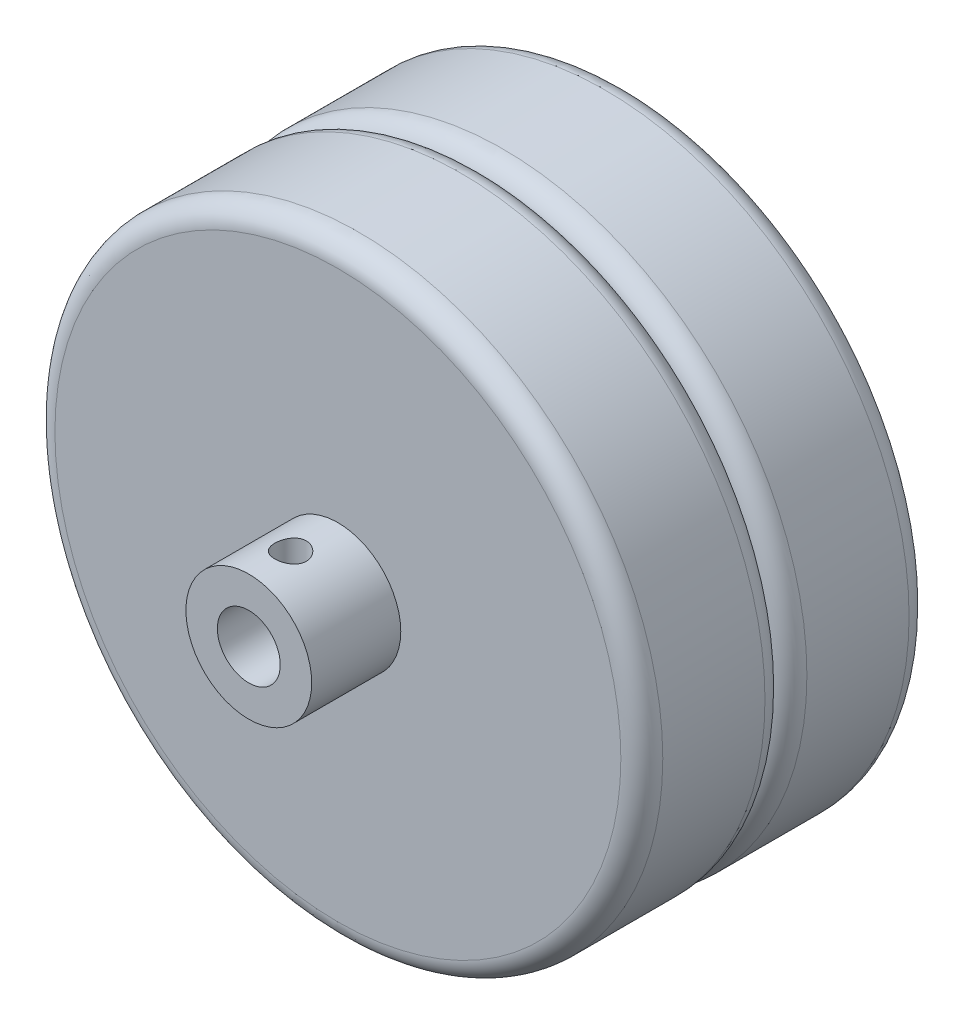
ISO-10303-21;
HEADER;
FILE_DESCRIPTION(('STEP AP214'),'2;1');
FILE_NAME('part.step','',(''),(''),'','','');
FILE_SCHEMA(('AUTOMOTIVE_DESIGN { 1 0 10303 214 1 1 1 1 }'));
ENDSEC;
DATA;
#1=APPLICATION_CONTEXT('core data for automotive mechanical design processes');
#2=APPLICATION_PROTOCOL_DEFINITION('international standard','automotive_design',2000,#1);
#3=PRODUCT_CONTEXT('',#1,'mechanical');
#4=PRODUCT('Part','Part','',(#3));
#5=PRODUCT_RELATED_PRODUCT_CATEGORY('part','',(#4));
#6=PRODUCT_DEFINITION_FORMATION('','',#4);
#7=PRODUCT_DEFINITION_CONTEXT('part definition',#1,'design');
#8=PRODUCT_DEFINITION('design','',#6,#7);
#9=PRODUCT_DEFINITION_SHAPE('','',#8);
#10=(LENGTH_UNIT() NAMED_UNIT(*) SI_UNIT(.MILLI.,.METRE.));
#11=(NAMED_UNIT(*) PLANE_ANGLE_UNIT() SI_UNIT($,.RADIAN.));
#12=(NAMED_UNIT(*) SI_UNIT($,.STERADIAN.) SOLID_ANGLE_UNIT());
#13=UNCERTAINTY_MEASURE_WITH_UNIT(LENGTH_MEASURE(1.E-05),#10,'distance_accuracy_value','');
#14=(GEOMETRIC_REPRESENTATION_CONTEXT(3) GLOBAL_UNCERTAINTY_ASSIGNED_CONTEXT((#13)) GLOBAL_UNIT_ASSIGNED_CONTEXT((#10,
#11,#12)) REPRESENTATION_CONTEXT('',''));
#15=CARTESIAN_POINT('',(0.,0.,0.));
#16=DIRECTION('',(0.,0.,1.));
#17=DIRECTION('',(1.,0.,0.));
#18=AXIS2_PLACEMENT_3D('',#15,#16,#17);
#19=CARTESIAN_POINT('',(0.,0.,36.));
#20=DIRECTION('',(0.,0.,1.));
#21=DIRECTION('',(1.,0.,0.));
#22=AXIS2_PLACEMENT_3D('',#19,#20,#21);
#23=PLANE('',#22);
#24=CARTESIAN_POINT('',(0.,0.,36.));
#25=DIRECTION('',(0.,0.,1.));
#26=DIRECTION('',(1.,0.,0.));
#27=AXIS2_PLACEMENT_3D('',#24,#25,#26);
#28=CIRCLE('',#27,6.);
#29=CARTESIAN_POINT('',(6.,0.,36.));
#30=VERTEX_POINT('',#29);
#31=EDGE_CURVE('E11',#30,#30,#28,.T.);
#32=ORIENTED_EDGE('',*,*,#31,.T.);
#33=EDGE_LOOP('',(#32));
#34=FACE_BOUND('',#33,.T.);
#35=CARTESIAN_POINT('',(0.,0.,36.));
#36=DIRECTION('',(0.,0.,1.));
#37=DIRECTION('',(1.,0.,0.));
#38=AXIS2_PLACEMENT_3D('',#35,#36,#37);
#39=CIRCLE('',#38,3.);
#40=CARTESIAN_POINT('',(3.,0.,36.));
#41=VERTEX_POINT('',#40);
#42=EDGE_CURVE('E58',#41,#41,#39,.T.);
#43=ORIENTED_EDGE('',*,*,#42,.F.);
#44=EDGE_LOOP('',(#43));
#45=FACE_BOUND('',#44,.T.);
#46=ADVANCED_FACE('F39',(#34,#45),#23,.T.);
#47=CARTESIAN_POINT('',(0.,0.,27.5));
#48=DIRECTION('',(0.,0.,1.));
#49=DIRECTION('',(1.,0.,0.));
#50=AXIS2_PLACEMENT_3D('',#47,#48,#49);
#51=PLANE('',#50);
#52=CARTESIAN_POINT('',(0.,0.,27.5));
#53=DIRECTION('',(0.,0.,1.));
#54=DIRECTION('',(1.,0.,0.));
#55=AXIS2_PLACEMENT_3D('',#52,#53,#54);
#56=CIRCLE('',#55,6.);
#57=CARTESIAN_POINT('',(6.,0.,27.5));
#58=VERTEX_POINT('',#57);
#59=EDGE_CURVE('E53',#58,#58,#56,.T.);
#60=ORIENTED_EDGE('',*,*,#59,.F.);
#61=EDGE_LOOP('',(#60));
#62=FACE_BOUND('',#61,.T.);
#63=CARTESIAN_POINT('',(0.,0.,27.5));
#64=DIRECTION('',(0.,0.,1.));
#65=DIRECTION('',(1.,0.,0.));
#66=AXIS2_PLACEMENT_3D('',#63,#64,#65);
#67=CIRCLE('',#66,3.);
#68=CARTESIAN_POINT('',(3.,0.,27.5));
#69=VERTEX_POINT('',#68);
#70=EDGE_CURVE('E60',#69,#69,#67,.T.);
#71=ORIENTED_EDGE('',*,*,#70,.T.);
#72=EDGE_LOOP('',(#71));
#73=FACE_BOUND('',#72,.T.);
#74=ADVANCED_FACE('F81',(#62,#73),#51,.F.);
#75=CARTESIAN_POINT('',(0.,0.,36.));
#76=DIRECTION('',(0.,0.,-1.));
#77=DIRECTION('',(-1.,0.,0.));
#78=AXIS2_PLACEMENT_3D('',#75,#76,#77);
#79=CYLINDRICAL_SURFACE('',#78,6.);
#80=CARTESIAN_POINT('',(0.,6.,33.5150195560629));
#81=CARTESIAN_POINT('',(-0.0828760886697312,5.99999859868013,33.5150172303247));
#82=CARTESIAN_POINT('',(-0.165778157830763,5.99826578131828,33.5081280052891));
#83=CARTESIAN_POINT('',(-0.329206323770533,5.99152113829892,33.4807944047559));
#84=CARTESIAN_POINT('',(-0.40973104687074,5.98650745419968,33.460342346525));
#85=CARTESIAN_POINT('',(-0.566020872182579,5.9737562633204,33.4065803026008));
#86=CARTESIAN_POINT('',(-0.641791563430005,5.96602202842087,33.3732857573476));
#87=CARTESIAN_POINT('',(-0.786672131904429,5.94865343807593,33.2948381660181));
#88=CARTESIAN_POINT('',(-0.855781784348761,5.9390190185405,33.249684719944));
#89=CARTESIAN_POINT('',(-0.986801927300921,5.91867413591801,33.1478187664087));
#90=CARTESIAN_POINT('',(-1.04855569006107,5.90794707148533,33.0909079811037));
#91=CARTESIAN_POINT('',(-1.1617489272033,5.8867362011753,32.967567351154));
#92=CARTESIAN_POINT('',(-1.21318723694914,5.87625242288348,32.9011364331164));
#93=CARTESIAN_POINT('',(-1.30502654279903,5.8565477569971,32.7594243293255));
#94=CARTESIAN_POINT('',(-1.34525221592536,5.84734794470605,32.6840263252525));
#95=CARTESIAN_POINT('',(-1.41239690855053,5.83149494812223,32.5272711444045));
#96=CARTESIAN_POINT('',(-1.43931805543933,5.82484135672789,32.4459149227371));
#97=CARTESIAN_POINT('',(-1.47855483680429,5.81500476717551,32.2812760578604));
#98=CARTESIAN_POINT('',(-1.49115226833334,5.81175491075426,32.1980646600131));
#99=CARTESIAN_POINT('',(-1.50226177506785,5.80889362537741,32.0306509870489));
#100=CARTESIAN_POINT('',(-1.50077614181798,5.80928160448644,31.9464488753643));
#101=CARTESIAN_POINT('',(-1.48398652463928,5.81359205496618,31.7816037483184));
#102=CARTESIAN_POINT('',(-1.46901834019052,5.81742863001879,31.7009239345978));
#103=CARTESIAN_POINT('',(-1.42622418690311,5.82806709676484,31.5432585051516));
#104=CARTESIAN_POINT('',(-1.39839730206943,5.83486919970696,31.4662731530339));
#105=CARTESIAN_POINT('',(-1.33038947793716,5.85075113904187,31.3172815398108));
#106=CARTESIAN_POINT('',(-1.29008666723291,5.85985327469421,31.2453333842733));
#107=CARTESIAN_POINT('',(-1.19835627601496,5.87929710846386,31.1091008463061));
#108=CARTESIAN_POINT('',(-1.14692674880884,5.88963902334735,31.0448178079956));
#109=CARTESIAN_POINT('',(-1.03266342468122,5.91075880539781,30.9238159403685));
#110=CARTESIAN_POINT('',(-0.969546258165862,5.92154069477971,30.8673650660015));
#111=CARTESIAN_POINT('',(-0.8346119175037,5.94205965578786,30.765798313599));
#112=CARTESIAN_POINT('',(-0.762794477707942,5.95179669549415,30.7206827817993));
#113=CARTESIAN_POINT('',(-0.612115888681389,5.96917732094183,30.6429689698385));
#114=CARTESIAN_POINT('',(-0.533231393208622,5.97681360127725,30.6104142158085));
#115=CARTESIAN_POINT('',(-0.370876008142882,5.98907916991419,30.5591022503533));
#116=CARTESIAN_POINT('',(-0.287405999150484,5.99370903339281,30.5403423996448));
#117=CARTESIAN_POINT('',(-0.120539970390026,5.99935499271375,30.5175619905041));
#118=CARTESIAN_POINT('',(-0.0371967199882086,6.00046053508279,30.5131765299876));
#119=CARTESIAN_POINT('',(0.129032874801509,5.99918804814451,30.5182685581184));
#120=CARTESIAN_POINT('',(0.211919259644596,5.99681033241847,30.527744798862));
#121=CARTESIAN_POINT('',(0.373614268776493,5.98889581127357,30.5599904644543));
#122=CARTESIAN_POINT('',(0.452465118968755,5.98340634185811,30.5825608195399));
#123=CARTESIAN_POINT('',(0.605257292452512,5.96988706634134,30.6401266400913));
#124=CARTESIAN_POINT('',(0.679198119032635,5.96185700369892,30.6751233603761));
#125=CARTESIAN_POINT('',(0.821523134429849,5.9439330792631,30.7572556849376));
#126=CARTESIAN_POINT('',(0.889785441835833,5.93400867366932,30.8045956684597));
#127=CARTESIAN_POINT('',(1.01752661364325,5.91344509187419,30.9098094648599));
#128=CARTESIAN_POINT('',(1.07700395897301,5.90280579251705,30.9676850956798));
#129=CARTESIAN_POINT('',(1.18699056807273,5.88168956960771,31.0940215169074));
#130=CARTESIAN_POINT('',(1.23724386762204,5.87122304187281,31.1627072590653));
#131=CARTESIAN_POINT('',(1.3255107590127,5.85192878377239,31.3077521905286));
#132=CARTESIAN_POINT('',(1.36352489415794,5.84310098067026,31.3841110390227));
#133=CARTESIAN_POINT('',(1.42595142060929,5.82818094734665,31.541925278476));
#134=CARTESIAN_POINT('',(1.45044439665407,5.82207255291906,31.6233471844069));
#135=CARTESIAN_POINT('',(1.48534565995378,5.81326744090183,31.789329193952));
#136=CARTESIAN_POINT('',(1.49575702747866,5.81056997719936,31.8738886070954));
#137=CARTESIAN_POINT('',(1.50203859033399,5.80894901203957,32.0411405799181));
#138=CARTESIAN_POINT('',(1.49831789778012,5.80991932728264,32.1238169911876));
#139=CARTESIAN_POINT('',(1.47737727831287,5.81527909007843,32.2873234447309));
#140=CARTESIAN_POINT('',(1.46015762268677,5.81966846891857,32.3681535240765));
#141=CARTESIAN_POINT('',(1.4129313194428,5.83131260682722,32.5252280151283));
#142=CARTESIAN_POINT('',(1.38300140468038,5.83855015236309,32.6014968613031));
#143=CARTESIAN_POINT('',(1.31126491360507,5.85507755724829,32.7479849387766));
#144=CARTESIAN_POINT('',(1.26945669003419,5.86436770120773,32.8182033292498));
#145=CARTESIAN_POINT('',(1.17386774863714,5.88425634263512,32.9525741850649));
#146=CARTESIAN_POINT('',(1.11980316291226,5.89488264831757,33.0165206294869));
#147=CARTESIAN_POINT('',(1.00178937118974,5.91608027246286,33.1345666008583));
#148=CARTESIAN_POINT('',(0.937837821261144,5.9266515772706,33.1886637861759));
#149=CARTESIAN_POINT('',(0.800467586702586,5.94677655647663,33.2864308646275));
#150=CARTESIAN_POINT('',(0.726898422316384,5.95630833365868,33.3298941697345));
#151=CARTESIAN_POINT('',(0.573266059510474,5.97304924975119,33.4037670190034));
#152=CARTESIAN_POINT('',(0.493207563436737,5.98026005199781,33.4341859167114));
#153=CARTESIAN_POINT('',(0.34441025324347,5.99048059565542,33.4765913863925));
#154=CARTESIAN_POINT('',(0.276380170908068,5.99402585052691,33.4909707991163));
#155=CARTESIAN_POINT('',(0.138906071536283,5.99878605231948,33.5101854996848));
#156=CARTESIAN_POINT('',(0.0694621612426162,6.00000117450894,33.5150215053682));
#157=CARTESIAN_POINT('',(0.,6.,33.5150195560629));
#158=B_SPLINE_CURVE_WITH_KNOTS('',3,(#80,#81,#82,#83,#84,#85,#86,#87,#88,#89,#90,#91,#92,#93,
#94,#95,#96,#97,#98,#99,#100,#101,#102,#103,#104,#105,#106,#107,#108,#109,#110,#111,#112,#113,
#114,#115,#116,#117,#118,#119,#120,#121,#122,#123,#124,#125,#126,#127,#128,#129,#130,#131,#132,
#133,#134,#135,#136,#137,#138,#139,#140,#141,#142,#143,#144,#145,#146,#147,#148,#149,#150,#151,
#152,#153,#154,#155,#156,#157),.UNSPECIFIED.,.T.,.F.,(4,2,2,2,2,2,2,2,2,2,2,2,2,2,2,2,2,2,2,2,2,
2,2,2,2,2,2,2,2,2,2,2,2,2,2,2,2,2,4),(0.,0.24837371247189,0.4968882377639,0.74510490228611,
0.993329940169332,1.24614435437139,1.49898729580062,1.75558647545807,2.01214461169369,
2.2635629509943,2.51494038112697,2.76022497007018,3.00552703466038,3.25330527873879,
3.50112690836162,3.7560150096902,4.01091089558247,4.26668229009114,4.52240473688643,
4.77158308949276,5.02073901112743,5.26620274514037,5.51169127322291,5.76153587565353,
6.01142363008019,6.26744509204477,6.52345518749509,6.77792254614038,7.03233423252409,
7.27943780398613,7.52653640956034,7.77216400559447,8.01782568136901,8.2698957640991,
8.52202569770419,8.77872185499589,9.03523363821351,9.2434224294215,9.4515955604304),.UNSPECIFIED.);
#159=CARTESIAN_POINT('',(0.,6.,33.5150195560629));
#160=VERTEX_POINT('',#159);
#161=EDGE_CURVE('E63',#160,#160,#158,.T.);
#162=ORIENTED_EDGE('',*,*,#161,.T.);
#163=EDGE_LOOP('',(#162));
#164=FACE_BOUND('',#163,.T.);
#165=ORIENTED_EDGE('',*,*,#31,.F.);
#166=EDGE_LOOP('',(#165));
#167=FACE_BOUND('',#166,.T.);
#168=ORIENTED_EDGE('',*,*,#59,.T.);
#169=EDGE_LOOP('',(#168));
#170=FACE_BOUND('',#169,.T.);
#171=ADVANCED_FACE('F41',(#164,#167,#170),#79,.T.);
#172=CARTESIAN_POINT('',(0.,0.,36.));
#173=DIRECTION('',(0.,0.,-1.));
#174=DIRECTION('',(-1.,0.,0.));
#175=AXIS2_PLACEMENT_3D('',#172,#173,#174);
#176=CYLINDRICAL_SURFACE('',#175,3.);
#177=CARTESIAN_POINT('',(0.,3.,33.5150195560629));
#178=CARTESIAN_POINT('',(-0.07885794442685,2.99999570107562,33.5150146025871));
#179=CARTESIAN_POINT('',(-0.157809899546344,2.99685736529635,33.5087644463813));
#180=CARTESIAN_POINT('',(-0.313380352903344,2.98461234055736,33.4840402355506));
#181=CARTESIAN_POINT('',(-0.389994130070445,2.97549431743379,33.4655429665662));
#182=CARTESIAN_POINT('',(-0.538400317320674,2.95224419105063,33.417228843138));
#183=CARTESIAN_POINT('',(-0.61021020440872,2.93813158766306,33.3874559796909));
#184=CARTESIAN_POINT('',(-0.747708925209898,2.90618664773642,33.3176636240154));
#185=CARTESIAN_POINT('',(-0.813398240985089,2.88835460450288,33.2776449396896));
#186=CARTESIAN_POINT('',(-0.941261726642864,2.84934387387093,33.185743681835));
#187=CARTESIAN_POINT('',(-1.00298281668316,2.82802798691306,33.1332898372034));
#188=CARTESIAN_POINT('',(-1.11716916730047,2.78489955370115,33.0192373371923));
#189=CARTESIAN_POINT('',(-1.16962737466015,2.76308664313552,32.9576317784042));
#190=CARTESIAN_POINT('',(-1.26787800067542,2.71948426796021,32.8212945317778));
#191=CARTESIAN_POINT('',(-1.31283800332746,2.69782780455198,32.745915408544));
#192=CARTESIAN_POINT('',(-1.38925234033604,2.65928968158481,32.5874685520836));
#193=CARTESIAN_POINT('',(-1.4207163224495,2.64240461410485,32.5044063629788));
#194=CARTESIAN_POINT('',(-1.46719866328288,2.61686800556713,32.33802189793));
#195=CARTESIAN_POINT('',(-1.48308878562066,2.6077840737557,32.2550128779618));
#196=CARTESIAN_POINT('',(-1.50064048996327,2.59772834922792,32.0870512993937));
#197=CARTESIAN_POINT('',(-1.50231613255961,2.59674854014932,32.0021007447562));
#198=CARTESIAN_POINT('',(-1.49203093075844,2.60266395385873,31.8435905195898));
#199=CARTESIAN_POINT('',(-1.48167683930523,2.6086314549302,31.7698835092283));
#200=CARTESIAN_POINT('',(-1.4504097735854,2.62614343100775,31.6254366920033));
#201=CARTESIAN_POINT('',(-1.42949343584648,2.63768968247664,31.5546978381049));
#202=CARTESIAN_POINT('',(-1.37731467057901,2.66531214619112,31.4161758572144));
#203=CARTESIAN_POINT('',(-1.34582260067399,2.68148760995998,31.3484999578842));
#204=CARTESIAN_POINT('',(-1.273562531502,2.71655106422106,31.2190681171779));
#205=CARTESIAN_POINT('',(-1.2327903657187,2.73544027170286,31.1573148526628));
#206=CARTESIAN_POINT('',(-1.13709908236918,2.77669736854929,31.0332376769481));
#207=CARTESIAN_POINT('',(-1.08104168755392,2.79920265355119,30.9718342456987));
#208=CARTESIAN_POINT('',(-0.959333368112062,2.84321434950611,30.8589164281765));
#209=CARTESIAN_POINT('',(-0.89367788486143,2.86472027938201,30.8074067680121));
#210=CARTESIAN_POINT('',(-0.750774758747774,2.90552980924446,30.7134910645183));
#211=CARTESIAN_POINT('',(-0.673130387399115,2.92468476243011,30.6716188473943));
#212=CARTESIAN_POINT('',(-0.510699323233196,2.95736821681863,30.6018740124984));
#213=CARTESIAN_POINT('',(-0.425918364397915,2.9709011841533,30.5739902785401));
#214=CARTESIAN_POINT('',(-0.259149737491054,2.98986500612153,30.5353064504879));
#215=CARTESIAN_POINT('',(-0.17751229582249,2.99587407451965,30.5232827024427));
#216=CARTESIAN_POINT('',(-0.0131693999240272,3.00109520188655,30.5128224593612));
#217=CARTESIAN_POINT('',(0.0695355298048634,3.00031048081978,30.5143795276037));
#218=CARTESIAN_POINT('',(0.22684945797898,2.99236788380152,30.530329588691));
#219=CARTESIAN_POINT('',(0.301589112074894,2.98570868532253,30.5437183551579));
#220=CARTESIAN_POINT('',(0.44761033845291,2.9673325697226,30.5813766639056));
#221=CARTESIAN_POINT('',(0.51889152853663,2.95561509501618,30.6056474057431));
#222=CARTESIAN_POINT('',(0.658332912674358,2.92776377120382,30.6650172557124));
#223=CARTESIAN_POINT('',(0.726345595508703,2.91151322654446,30.7004061312373));
#224=CARTESIAN_POINT('',(0.855692042548906,2.87615961476127,30.7806808595327));
#225=CARTESIAN_POINT('',(0.917022944664887,2.85705533350408,30.825570757956));
#226=CARTESIAN_POINT('',(1.03765153393382,2.81562332004297,30.928660194059));
#227=CARTESIAN_POINT('',(1.09615811672854,2.79316327265249,30.9877338587306));
#228=CARTESIAN_POINT('',(1.20278448167828,2.7489358741323,31.1149072829795));
#229=CARTESIAN_POINT('',(1.25089707856781,2.72716901100071,31.1830132343348));
#230=CARTESIAN_POINT('',(1.33756187171853,2.68576788309734,31.3304850373224));
#231=CARTESIAN_POINT('',(1.37553824370037,2.66628794383591,31.4102364552046));
#232=CARTESIAN_POINT('',(1.43712423890206,2.63361108441202,31.5762846574254));
#233=CARTESIAN_POINT('',(1.46075237380053,2.62040607332625,31.6625728457632));
#234=CARTESIAN_POINT('',(1.49079253120031,2.60342251538703,31.83038489039));
#235=CARTESIAN_POINT('',(1.49863949460818,2.59886075197597,31.9115709362158));
#236=CARTESIAN_POINT('',(1.5010337315643,2.59748031962405,32.0741901568097));
#237=CARTESIAN_POINT('',(1.49558676993486,2.60065829439585,32.1556232091697));
#238=CARTESIAN_POINT('',(1.47288918838997,2.61356793076615,32.308244808363));
#239=CARTESIAN_POINT('',(1.45681247151455,2.62264641723988,32.37967026128));
#240=CARTESIAN_POINT('',(1.41476303733662,2.64556524281479,32.5187317351994));
#241=CARTESIAN_POINT('',(1.38878713673988,2.65940711354503,32.5863665292009));
#242=CARTESIAN_POINT('',(1.32572361795085,2.69142795546804,32.7209568325427));
#243=CARTESIAN_POINT('',(1.28800670672355,2.70983583593881,32.7875614088064));
#244=CARTESIAN_POINT('',(1.20322645745609,2.7485299745229,32.9139313603348));
#245=CARTESIAN_POINT('',(1.15615825686235,2.76881720693416,32.9736931518446));
#246=CARTESIAN_POINT('',(1.04730498999206,2.81193484737138,33.0922325295949));
#247=CARTESIAN_POINT('',(0.984426634495894,2.83477474959942,33.1500082095883));
#248=CARTESIAN_POINT('',(0.849232209349798,2.87816628389896,33.2544140312158));
#249=CARTESIAN_POINT('',(0.776911084957798,2.89871667939293,33.3010381652677));
#250=CARTESIAN_POINT('',(0.623897395174421,2.93547014349806,33.381874100131));
#251=CARTESIAN_POINT('',(0.543149255665098,2.95164144740899,33.4159958099176));
#252=CARTESIAN_POINT('',(0.37611315170713,2.9775201194848,33.469731807699));
#253=CARTESIAN_POINT('',(0.28984169938365,2.98724585044602,33.4893873262715));
#254=CARTESIAN_POINT('',(0.168902919736342,2.99543192870217,33.5058656726915));
#255=CARTESIAN_POINT('',(0.135242819162347,2.99714048010376,33.5092935173624));
#256=CARTESIAN_POINT('',(0.0677275977076368,2.99942545465223,33.513871554334));
#257=CARTESIAN_POINT('',(0.0338724714699424,3.00000184655071,33.5150216837682));
#258=CARTESIAN_POINT('',(0.,3.,33.5150195560629));
#259=B_SPLINE_CURVE_WITH_KNOTS('',3,(#177,#178,#179,#180,#181,#182,#183,#184,#185,#186,#187,
#188,#189,#190,#191,#192,#193,#194,#195,#196,#197,#198,#199,#200,#201,#202,#203,#204,#205,#206,
#207,#208,#209,#210,#211,#212,#213,#214,#215,#216,#217,#218,#219,#220,#221,#222,#223,#224,#225,
#226,#227,#228,#229,#230,#231,#232,#233,#234,#235,#236,#237,#238,#239,#240,#241,#242,#243,#244,
#245,#246,#247,#248,#249,#250,#251,#252,#253,#254,#255,#256,#257,#258),.UNSPECIFIED.,.T.,.F.,(4,
2,2,2,2,2,2,2,2,2,2,2,2,2,2,2,2,2,2,2,2,2,2,2,2,2,2,2,2,2,2,2,2,2,2,2,2,2,2,2,4),(0.,
0.236436386130439,0.473322224563796,0.709293233238449,0.945245640872353,1.19547263807713,
1.44588935648105,1.71572589646129,1.98536921847421,2.23887018210344,2.4921203599353,
2.71508568613981,2.93812205888518,3.16635360252732,3.39468781890333,3.65197412000818,
3.9093830189803,4.17874533321661,4.4478932536842,4.69474935707019,4.94148846767214,
5.16910359759183,5.39674382446398,5.63089284041848,5.86514176122509,6.12239415966628,
6.37982382923148,6.6497202324259,6.91926767918177,7.16293961254571,7.40650589797018,
7.62686895373284,7.84730293182528,8.08254685170431,8.31791341715446,8.58187864135757,
8.84598575071869,9.1119602049529,9.37717362931724,9.47872920200876,9.580287577666),.UNSPECIFIED.);
#260=CARTESIAN_POINT('',(0.,3.,33.5150195560629));
#261=VERTEX_POINT('',#260);
#262=EDGE_CURVE('E44',#261,#261,#259,.T.);
#263=ORIENTED_EDGE('',*,*,#262,.F.);
#264=EDGE_LOOP('',(#263));
#265=FACE_BOUND('',#264,.T.);
#266=ORIENTED_EDGE('',*,*,#42,.T.);
#267=EDGE_LOOP('',(#266));
#268=FACE_BOUND('',#267,.T.);
#269=ORIENTED_EDGE('',*,*,#70,.F.);
#270=EDGE_LOOP('',(#269));
#271=FACE_BOUND('',#270,.T.);
#272=ADVANCED_FACE('F73',(#265,#268,#271),#176,.F.);
#273=CARTESIAN_POINT('',(0.,1.,32.0150195560629));
#274=DIRECTION('',(0.,1.,0.));
#275=DIRECTION('',(0.,0.,1.));
#276=AXIS2_PLACEMENT_3D('',#273,#274,#275);
#277=CYLINDRICAL_SURFACE('',#276,1.5);
#278=ORIENTED_EDGE('',*,*,#262,.T.);
#279=EDGE_LOOP('',(#278));
#280=FACE_BOUND('',#279,.T.);
#281=ORIENTED_EDGE('',*,*,#161,.F.);
#282=EDGE_LOOP('',(#281));
#283=FACE_BOUND('',#282,.T.);
#284=ADVANCED_FACE('F70',(#280,#283),#277,.F.);
#285=CLOSED_SHELL('',(#46,#74,#171,#272,#284));
#286=MANIFOLD_SOLID_BREP('B2',#285);
#287=CARTESIAN_POINT('',(0.,0.,13.75));
#288=DIRECTION('',(0.,0.,-1.));
#289=DIRECTION('',(-1.,0.,0.));
#290=AXIS2_PLACEMENT_3D('',#287,#288,#289);
#291=CYLINDRICAL_SURFACE('',#290,29.);
#292=CARTESIAN_POINT('',(0.,0.,2.));
#293=DIRECTION('',(0.,0.,1.));
#294=DIRECTION('',(1.,0.,0.));
#295=AXIS2_PLACEMENT_3D('',#292,#293,#294);
#296=CIRCLE('',#295,29.);
#297=CARTESIAN_POINT('',(29.,0.,2.));
#298=VERTEX_POINT('',#297);
#299=EDGE_CURVE('E152',#298,#298,#296,.T.);
#300=ORIENTED_EDGE('',*,*,#299,.T.);
#301=EDGE_LOOP('',(#300));
#302=FACE_BOUND('',#301,.T.);
#303=CARTESIAN_POINT('',(0.,0.,11.75));
#304=DIRECTION('',(0.,0.,1.));
#305=DIRECTION('',(1.,0.,0.));
#306=AXIS2_PLACEMENT_3D('',#303,#304,#305);
#307=CIRCLE('',#306,29.);
#308=CARTESIAN_POINT('',(29.,0.,11.75));
#309=VERTEX_POINT('',#308);
#310=EDGE_CURVE('E155',#309,#309,#307,.F.);
#311=ORIENTED_EDGE('',*,*,#310,.T.);
#312=EDGE_LOOP('',(#311));
#313=FACE_BOUND('',#312,.T.);
#314=ADVANCED_FACE('F132',(#302,#313),#291,.T.);
#315=CARTESIAN_POINT('',(0.,0.,0.));
#316=DIRECTION('',(0.,0.,1.));
#317=DIRECTION('',(1.,0.,0.));
#318=AXIS2_PLACEMENT_3D('',#315,#316,#317);
#319=PLANE('',#318);
#320=CARTESIAN_POINT('',(0.,0.,0.));
#321=DIRECTION('',(0.,0.,1.));
#322=DIRECTION('',(1.,0.,0.));
#323=AXIS2_PLACEMENT_3D('',#320,#321,#322);
#324=CIRCLE('',#323,27.);
#325=CARTESIAN_POINT('',(27.,0.,0.));
#326=VERTEX_POINT('',#325);
#327=EDGE_CURVE('E147',#326,#326,#324,.F.);
#328=ORIENTED_EDGE('',*,*,#327,.T.);
#329=EDGE_LOOP('',(#328));
#330=FACE_BOUND('',#329,.T.);
#331=ADVANCED_FACE('F189',(#330),#319,.F.);
#332=CARTESIAN_POINT('',(0.,0.,11.75));
#333=DIRECTION('',(0.,0.,1.));
#334=DIRECTION('',(1.,0.,0.));
#335=AXIS2_PLACEMENT_3D('',#332,#333,#334);
#336=TOROIDAL_SURFACE('',#335,27.,2.);
#337=ORIENTED_EDGE('',*,*,#310,.F.);
#338=EDGE_LOOP('',(#337));
#339=FACE_BOUND('',#338,.T.);
#340=CARTESIAN_POINT('',(0.,0.,13.75));
#341=DIRECTION('',(0.,0.,1.));
#342=DIRECTION('',(1.,0.,0.));
#343=AXIS2_PLACEMENT_3D('',#340,#341,#342);
#344=CIRCLE('',#343,27.);
#345=CARTESIAN_POINT('',(27.,0.,13.75));
#346=VERTEX_POINT('',#345);
#347=EDGE_CURVE('E158',#346,#346,#344,.T.);
#348=ORIENTED_EDGE('',*,*,#347,.F.);
#349=EDGE_LOOP('',(#348));
#350=FACE_BOUND('',#349,.T.);
#351=ADVANCED_FACE('F195',(#339,#350),#336,.T.);
#352=CARTESIAN_POINT('',(0.,0.,2.));
#353=DIRECTION('',(0.,0.,1.));
#354=DIRECTION('',(1.,0.,0.));
#355=AXIS2_PLACEMENT_3D('',#352,#353,#354);
#356=TOROIDAL_SURFACE('',#355,27.,2.);
#357=ORIENTED_EDGE('',*,*,#327,.F.);
#358=EDGE_LOOP('',(#357));
#359=FACE_BOUND('',#358,.T.);
#360=ORIENTED_EDGE('',*,*,#299,.F.);
#361=EDGE_LOOP('',(#360));
#362=FACE_BOUND('',#361,.T.);
#363=ADVANCED_FACE('F186',(#359,#362),#356,.T.);
#364=CARTESIAN_POINT('',(0.,0.,27.5));
#365=DIRECTION('',(0.,0.,-1.));
#366=DIRECTION('',(-1.,0.,0.));
#367=AXIS2_PLACEMENT_3D('',#364,#365,#366);
#368=CYLINDRICAL_SURFACE('',#367,29.);
#369=CARTESIAN_POINT('',(0.,0.,15.75));
#370=DIRECTION('',(0.,0.,1.));
#371=DIRECTION('',(1.,0.,0.));
#372=AXIS2_PLACEMENT_3D('',#369,#370,#371);
#373=CIRCLE('',#372,29.);
#374=CARTESIAN_POINT('',(29.,0.,15.75));
#375=VERTEX_POINT('',#374);
#376=EDGE_CURVE('E139',#375,#375,#373,.T.);
#377=ORIENTED_EDGE('',*,*,#376,.T.);
#378=EDGE_LOOP('',(#377));
#379=FACE_BOUND('',#378,.T.);
#380=CARTESIAN_POINT('',(0.,0.,25.5));
#381=DIRECTION('',(0.,0.,1.));
#382=DIRECTION('',(1.,0.,0.));
#383=AXIS2_PLACEMENT_3D('',#380,#381,#382);
#384=CIRCLE('',#383,29.);
#385=CARTESIAN_POINT('',(29.,0.,25.5));
#386=VERTEX_POINT('',#385);
#387=EDGE_CURVE('E143',#386,#386,#384,.F.);
#388=ORIENTED_EDGE('',*,*,#387,.T.);
#389=EDGE_LOOP('',(#388));
#390=FACE_BOUND('',#389,.T.);
#391=ADVANCED_FACE('F179',(#379,#390),#368,.T.);
#392=CARTESIAN_POINT('',(0.,0.,27.5));
#393=DIRECTION('',(0.,0.,1.));
#394=DIRECTION('',(1.,0.,0.));
#395=AXIS2_PLACEMENT_3D('',#392,#393,#394);
#396=PLANE('',#395);
#397=CARTESIAN_POINT('',(0.,0.,27.5));
#398=DIRECTION('',(0.,0.,1.));
#399=DIRECTION('',(1.,0.,0.));
#400=AXIS2_PLACEMENT_3D('',#397,#398,#399);
#401=CIRCLE('',#400,6.);
#402=CARTESIAN_POINT('',(6.,0.,27.5));
#403=VERTEX_POINT('',#402);
#404=EDGE_CURVE('E162',#403,#403,#401,.T.);
#405=ORIENTED_EDGE('',*,*,#404,.F.);
#406=EDGE_LOOP('',(#405));
#407=FACE_BOUND('',#406,.T.);
#408=CARTESIAN_POINT('',(0.,0.,27.5));
#409=DIRECTION('',(0.,0.,1.));
#410=DIRECTION('',(1.,0.,0.));
#411=AXIS2_PLACEMENT_3D('',#408,#409,#410);
#412=CIRCLE('',#411,27.);
#413=CARTESIAN_POINT('',(27.,0.,27.5));
#414=VERTEX_POINT('',#413);
#415=EDGE_CURVE('E38',#414,#414,#412,.T.);
#416=ORIENTED_EDGE('',*,*,#415,.T.);
#417=EDGE_LOOP('',(#416));
#418=FACE_BOUND('',#417,.T.);
#419=ADVANCED_FACE('F176',(#407,#418),#396,.T.);
#420=CARTESIAN_POINT('',(0.,0.,15.75));
#421=DIRECTION('',(0.,0.,1.));
#422=DIRECTION('',(1.,0.,0.));
#423=AXIS2_PLACEMENT_3D('',#420,#421,#422);
#424=TOROIDAL_SURFACE('',#423,27.,2.);
#425=ORIENTED_EDGE('',*,*,#347,.T.);
#426=EDGE_LOOP('',(#425));
#427=FACE_BOUND('',#426,.T.);
#428=ORIENTED_EDGE('',*,*,#376,.F.);
#429=EDGE_LOOP('',(#428));
#430=FACE_BOUND('',#429,.T.);
#431=ADVANCED_FACE('F178',(#427,#430),#424,.T.);
#432=CARTESIAN_POINT('',(0.,0.,25.5));
#433=DIRECTION('',(0.,0.,1.));
#434=DIRECTION('',(1.,0.,0.));
#435=AXIS2_PLACEMENT_3D('',#432,#433,#434);
#436=TOROIDAL_SURFACE('',#435,27.,2.);
#437=ORIENTED_EDGE('',*,*,#387,.F.);
#438=EDGE_LOOP('',(#437));
#439=FACE_BOUND('',#438,.T.);
#440=ORIENTED_EDGE('',*,*,#415,.F.);
#441=EDGE_LOOP('',(#440));
#442=FACE_BOUND('',#441,.T.);
#443=ADVANCED_FACE('F134',(#439,#442),#436,.T.);
#444=CARTESIAN_POINT('',(0.,0.,3.5));
#445=DIRECTION('',(0.,0.,1.));
#446=DIRECTION('',(1.,0.,0.));
#447=AXIS2_PLACEMENT_3D('',#444,#445,#446);
#448=CYLINDRICAL_SURFACE('',#447,6.);
#449=CARTESIAN_POINT('',(0.,0.,3.5));
#450=DIRECTION('',(0.,0.,1.));
#451=DIRECTION('',(1.,0.,0.));
#452=AXIS2_PLACEMENT_3D('',#449,#450,#451);
#453=CIRCLE('',#452,6.);
#454=CARTESIAN_POINT('',(6.,0.,3.5));
#455=VERTEX_POINT('',#454);
#456=EDGE_CURVE('E161',#455,#455,#453,.T.);
#457=ORIENTED_EDGE('',*,*,#456,.F.);
#458=EDGE_LOOP('',(#457));
#459=FACE_BOUND('',#458,.T.);
#460=ORIENTED_EDGE('',*,*,#404,.T.);
#461=EDGE_LOOP('',(#460));
#462=FACE_BOUND('',#461,.T.);
#463=ADVANCED_FACE('F170',(#459,#462),#448,.F.);
#464=CARTESIAN_POINT('',(0.,0.,3.5));
#465=DIRECTION('',(0.,0.,1.));
#466=DIRECTION('',(1.,0.,0.));
#467=AXIS2_PLACEMENT_3D('',#464,#465,#466);
#468=PLANE('',#467);
#469=ORIENTED_EDGE('',*,*,#456,.T.);
#470=EDGE_LOOP('',(#469));
#471=FACE_BOUND('',#470,.T.);
#472=ADVANCED_FACE('F168',(#471),#468,.T.);
#473=CLOSED_SHELL('',(#314,#331,#351,#363,#391,#419,#431,#443,#463,#472));
#474=MANIFOLD_SOLID_BREP('B6',#473);
#475=ADVANCED_BREP_SHAPE_REPRESENTATION('',(#18,#286,#474),#14);
#476=SHAPE_DEFINITION_REPRESENTATION(#9,#475);
ENDSEC;
END-ISO-10303-21;
